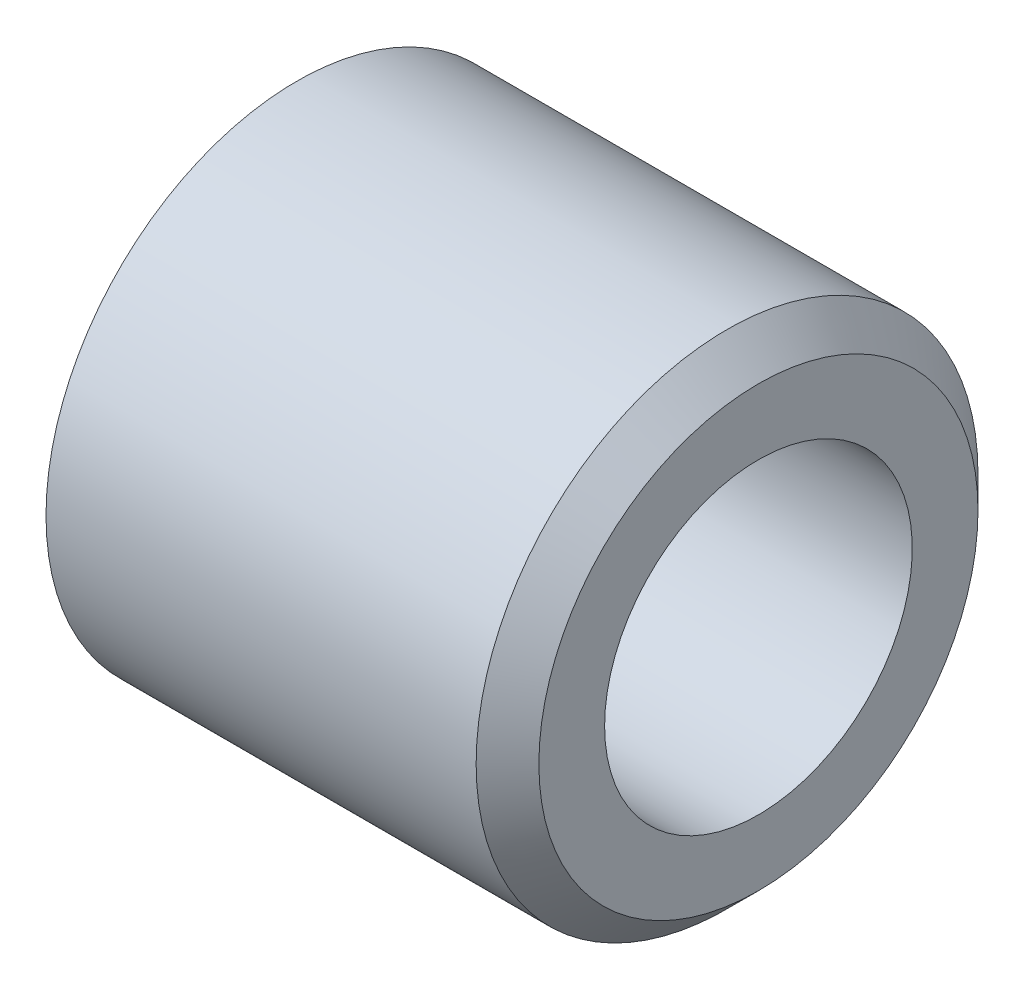
ISO-10303-21;
HEADER;
FILE_DESCRIPTION(('STEP AP214'),'2;1');
FILE_NAME('part.step','',(''),(''),'','','');
FILE_SCHEMA(('AUTOMOTIVE_DESIGN { 1 0 10303 214 1 1 1 1 }'));
ENDSEC;
DATA;
#1=APPLICATION_CONTEXT('core data for automotive mechanical design processes');
#2=APPLICATION_PROTOCOL_DEFINITION('international standard','automotive_design',2000,#1);
#3=PRODUCT_CONTEXT('',#1,'mechanical');
#4=PRODUCT('Part','Part','',(#3));
#5=PRODUCT_RELATED_PRODUCT_CATEGORY('part','',(#4));
#6=PRODUCT_DEFINITION_FORMATION('','',#4);
#7=PRODUCT_DEFINITION_CONTEXT('part definition',#1,'design');
#8=PRODUCT_DEFINITION('design','',#6,#7);
#9=PRODUCT_DEFINITION_SHAPE('','',#8);
#10=(LENGTH_UNIT() NAMED_UNIT(*) SI_UNIT(.MILLI.,.METRE.));
#11=(NAMED_UNIT(*) PLANE_ANGLE_UNIT() SI_UNIT($,.RADIAN.));
#12=(NAMED_UNIT(*) SI_UNIT($,.STERADIAN.) SOLID_ANGLE_UNIT());
#13=UNCERTAINTY_MEASURE_WITH_UNIT(LENGTH_MEASURE(1.E-05),#10,'distance_accuracy_value','');
#14=(GEOMETRIC_REPRESENTATION_CONTEXT(3) GLOBAL_UNCERTAINTY_ASSIGNED_CONTEXT((#13)) GLOBAL_UNIT_ASSIGNED_CONTEXT((#10,
#11,#12)) REPRESENTATION_CONTEXT('',''));
#15=CARTESIAN_POINT('',(0.,0.,0.));
#16=DIRECTION('',(0.,0.,1.));
#17=DIRECTION('',(1.,0.,0.));
#18=AXIS2_PLACEMENT_3D('',#15,#16,#17);
#19=CARTESIAN_POINT('',(0.,0.,0.));
#20=DIRECTION('',(-1.,0.,0.));
#21=DIRECTION('',(0.,0.,1.));
#22=AXIS2_PLACEMENT_3D('',#19,#20,#21);
#23=CYLINDRICAL_SURFACE('',#22,5.17906);
#24=CARTESIAN_POINT('',(8.8776175,0.,0.));
#25=DIRECTION('',(-1.,0.,0.));
#26=DIRECTION('',(0.,0.,1.));
#27=AXIS2_PLACEMENT_3D('',#24,#25,#26);
#28=CIRCLE('',#27,5.17906);
#29=CARTESIAN_POINT('',(8.8776175,0.,5.17906));
#30=VERTEX_POINT('',#29);
#31=EDGE_CURVE('E66',#30,#30,#28,.T.);
#32=ORIENTED_EDGE('',*,*,#31,.T.);
#33=EDGE_LOOP('',(#32));
#34=FACE_BOUND('',#33,.T.);
#35=CARTESIAN_POINT('',(0.,0.,0.));
#36=DIRECTION('',(-1.,0.,0.));
#37=DIRECTION('',(0.,0.,1.));
#38=AXIS2_PLACEMENT_3D('',#35,#36,#37);
#39=CIRCLE('',#38,5.17906);
#40=CARTESIAN_POINT('',(0.,0.,5.17906));
#41=VERTEX_POINT('',#40);
#42=EDGE_CURVE('E10',#41,#41,#39,.T.);
#43=ORIENTED_EDGE('',*,*,#42,.F.);
#44=EDGE_LOOP('',(#43));
#45=FACE_BOUND('',#44,.T.);
#46=ADVANCED_FACE('F34',(#34,#45),#23,.T.);
#47=CARTESIAN_POINT('',(0.,3.9624,0.));
#48=DIRECTION('',(-1.,0.,0.));
#49=DIRECTION('',(0.,0.,1.));
#50=AXIS2_PLACEMENT_3D('',#47,#48,#49);
#51=PLANE('',#50);
#52=ORIENTED_EDGE('',*,*,#42,.T.);
#53=EDGE_LOOP('',(#52));
#54=FACE_BOUND('',#53,.T.);
#55=CARTESIAN_POINT('',(0.,0.,0.));
#56=DIRECTION('',(-1.,0.,0.));
#57=DIRECTION('',(0.,0.,1.));
#58=AXIS2_PLACEMENT_3D('',#55,#56,#57);
#59=CIRCLE('',#58,3.9624);
#60=CARTESIAN_POINT('',(0.,0.,3.9624));
#61=VERTEX_POINT('',#60);
#62=EDGE_CURVE('E41',#61,#61,#59,.T.);
#63=ORIENTED_EDGE('',*,*,#62,.F.);
#64=EDGE_LOOP('',(#63));
#65=FACE_BOUND('',#64,.T.);
#66=ADVANCED_FACE('F86',(#54,#65),#51,.T.);
#67=CARTESIAN_POINT('',(0.7874,0.,0.));
#68=DIRECTION('',(-1.,0.,0.));
#69=DIRECTION('',(0.,0.,1.));
#70=AXIS2_PLACEMENT_3D('',#67,#68,#69);
#71=TOROIDAL_SURFACE('',#70,3.9624,0.7874);
#72=CARTESIAN_POINT('',(0.7874,0.,0.));
#73=DIRECTION('',(-1.,0.,0.));
#74=DIRECTION('',(0.,0.,1.));
#75=AXIS2_PLACEMENT_3D('',#72,#73,#74);
#76=CIRCLE('',#75,3.175);
#77=CARTESIAN_POINT('',(0.7874,0.,3.175));
#78=VERTEX_POINT('',#77);
#79=EDGE_CURVE('E49',#78,#78,#76,.T.);
#80=ORIENTED_EDGE('',*,*,#79,.F.);
#81=EDGE_LOOP('',(#80));
#82=FACE_BOUND('',#81,.T.);
#83=ORIENTED_EDGE('',*,*,#62,.T.);
#84=EDGE_LOOP('',(#83));
#85=FACE_BOUND('',#84,.T.);
#86=ADVANCED_FACE('F89',(#82,#85),#71,.T.);
#87=CARTESIAN_POINT('',(0.,0.,0.));
#88=DIRECTION('',(-1.,0.,0.));
#89=DIRECTION('',(0.,0.,1.));
#90=AXIS2_PLACEMENT_3D('',#87,#88,#89);
#91=CYLINDRICAL_SURFACE('',#90,3.175);
#92=ORIENTED_EDGE('',*,*,#79,.T.);
#93=EDGE_LOOP('',(#92));
#94=FACE_BOUND('',#93,.T.);
#95=CARTESIAN_POINT('',(9.525,0.,0.));
#96=DIRECTION('',(-1.,0.,0.));
#97=DIRECTION('',(0.,0.,1.));
#98=AXIS2_PLACEMENT_3D('',#95,#96,#97);
#99=CIRCLE('',#98,3.175);
#100=CARTESIAN_POINT('',(9.525,0.,3.175));
#101=VERTEX_POINT('',#100);
#102=EDGE_CURVE('E56',#101,#101,#99,.T.);
#103=ORIENTED_EDGE('',*,*,#102,.F.);
#104=EDGE_LOOP('',(#103));
#105=FACE_BOUND('',#104,.T.);
#106=ADVANCED_FACE('F82',(#94,#105),#91,.F.);
#107=CARTESIAN_POINT('',(9.525,4.5316775,0.));
#108=DIRECTION('',(1.,0.,0.));
#109=DIRECTION('',(0.,0.,-1.));
#110=AXIS2_PLACEMENT_3D('',#107,#108,#109);
#111=PLANE('',#110);
#112=ORIENTED_EDGE('',*,*,#102,.T.);
#113=EDGE_LOOP('',(#112));
#114=FACE_BOUND('',#113,.T.);
#115=CARTESIAN_POINT('',(9.525,0.,0.));
#116=DIRECTION('',(-1.,0.,0.));
#117=DIRECTION('',(0.,0.,1.));
#118=AXIS2_PLACEMENT_3D('',#115,#116,#117);
#119=CIRCLE('',#118,4.5316775);
#120=CARTESIAN_POINT('',(9.525,0.,4.5316775));
#121=VERTEX_POINT('',#120);
#122=EDGE_CURVE('E62',#121,#121,#119,.T.);
#123=ORIENTED_EDGE('',*,*,#122,.F.);
#124=EDGE_LOOP('',(#123));
#125=FACE_BOUND('',#124,.T.);
#126=ADVANCED_FACE('F77',(#114,#125),#111,.T.);
#127=CARTESIAN_POINT('',(8.8776175,0.,0.));
#128=DIRECTION('',(-1.,0.,0.));
#129=DIRECTION('',(0.,0.,1.));
#130=AXIS2_PLACEMENT_3D('',#127,#128,#129);
#131=CONICAL_SURFACE('',#130,5.17906,0.785398163397448);
#132=ORIENTED_EDGE('',*,*,#122,.T.);
#133=EDGE_LOOP('',(#132));
#134=FACE_BOUND('',#133,.T.);
#135=ORIENTED_EDGE('',*,*,#31,.F.);
#136=EDGE_LOOP('',(#135));
#137=FACE_BOUND('',#136,.T.);
#138=ADVANCED_FACE('F75',(#134,#137),#131,.T.);
#139=CLOSED_SHELL('',(#46,#66,#86,#106,#126,#138));
#140=MANIFOLD_SOLID_BREP('B2',#139);
#141=ADVANCED_BREP_SHAPE_REPRESENTATION('',(#18,#140),#14);
#142=SHAPE_DEFINITION_REPRESENTATION(#9,#141);
ENDSEC;
END-ISO-10303-21;
